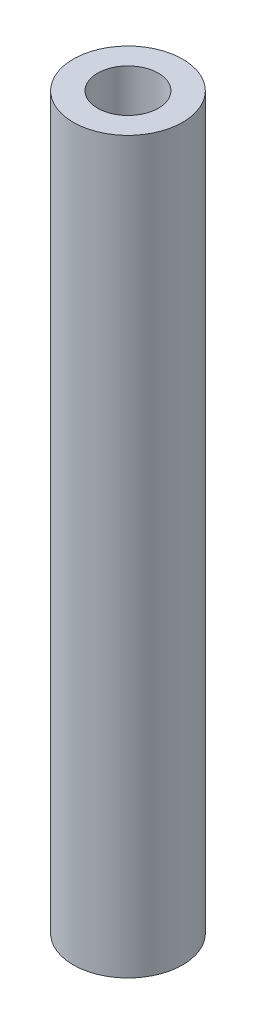
ISO-10303-21;
HEADER;
FILE_DESCRIPTION(('STEP AP214'),'2;1');
FILE_NAME('part.step','',(''),(''),'','','');
FILE_SCHEMA(('AUTOMOTIVE_DESIGN { 1 0 10303 214 1 1 1 1 }'));
ENDSEC;
DATA;
#1=APPLICATION_CONTEXT('core data for automotive mechanical design processes');
#2=APPLICATION_PROTOCOL_DEFINITION('international standard','automotive_design',2000,#1);
#3=PRODUCT_CONTEXT('',#1,'mechanical');
#4=PRODUCT('Part','Part','',(#3));
#5=PRODUCT_RELATED_PRODUCT_CATEGORY('part','',(#4));
#6=PRODUCT_DEFINITION_FORMATION('','',#4);
#7=PRODUCT_DEFINITION_CONTEXT('part definition',#1,'design');
#8=PRODUCT_DEFINITION('design','',#6,#7);
#9=PRODUCT_DEFINITION_SHAPE('','',#8);
#10=(LENGTH_UNIT() NAMED_UNIT(*) SI_UNIT(.MILLI.,.METRE.));
#11=(NAMED_UNIT(*) PLANE_ANGLE_UNIT() SI_UNIT($,.RADIAN.));
#12=(NAMED_UNIT(*) SI_UNIT($,.STERADIAN.) SOLID_ANGLE_UNIT());
#13=UNCERTAINTY_MEASURE_WITH_UNIT(LENGTH_MEASURE(1.E-05),#10,'distance_accuracy_value','');
#14=(GEOMETRIC_REPRESENTATION_CONTEXT(3) GLOBAL_UNCERTAINTY_ASSIGNED_CONTEXT((#13)) GLOBAL_UNIT_ASSIGNED_CONTEXT((#10,
#11,#12)) REPRESENTATION_CONTEXT('',''));
#15=CARTESIAN_POINT('',(0.,0.,0.));
#16=DIRECTION('',(0.,0.,1.));
#17=DIRECTION('',(1.,0.,0.));
#18=AXIS2_PLACEMENT_3D('',#15,#16,#17);
#19=CARTESIAN_POINT('',(0.,30.,0.));
#20=DIRECTION('',(0.,1.,0.));
#21=DIRECTION('',(0.,0.,1.));
#22=AXIS2_PLACEMENT_3D('',#19,#20,#21);
#23=PLANE('',#22);
#24=CARTESIAN_POINT('',(0.,30.,0.));
#25=DIRECTION('',(0.,1.,0.));
#26=DIRECTION('',(0.,0.,1.));
#27=AXIS2_PLACEMENT_3D('',#24,#25,#26);
#28=CIRCLE('',#27,2.25);
#29=CARTESIAN_POINT('',(0.,30.,2.25));
#30=VERTEX_POINT('',#29);
#31=EDGE_CURVE('E10',#30,#30,#28,.T.);
#32=ORIENTED_EDGE('',*,*,#31,.T.);
#33=EDGE_LOOP('',(#32));
#34=FACE_BOUND('',#33,.T.);
#35=CARTESIAN_POINT('',(0.,30.,0.));
#36=DIRECTION('',(0.,1.,0.));
#37=DIRECTION('',(0.,0.,1.));
#38=AXIS2_PLACEMENT_3D('',#35,#36,#37);
#39=CIRCLE('',#38,1.25);
#40=CARTESIAN_POINT('',(0.,30.,1.25));
#41=VERTEX_POINT('',#40);
#42=EDGE_CURVE('E54',#41,#41,#39,.T.);
#43=ORIENTED_EDGE('',*,*,#42,.F.);
#44=EDGE_LOOP('',(#43));
#45=FACE_BOUND('',#44,.T.);
#46=ADVANCED_FACE('F41',(#34,#45),#23,.T.);
#47=CARTESIAN_POINT('',(0.,0.,0.));
#48=DIRECTION('',(0.,1.,0.));
#49=DIRECTION('',(0.,0.,1.));
#50=AXIS2_PLACEMENT_3D('',#47,#48,#49);
#51=PLANE('',#50);
#52=CARTESIAN_POINT('',(0.,0.,0.));
#53=DIRECTION('',(0.,1.,0.));
#54=DIRECTION('',(0.,0.,1.));
#55=AXIS2_PLACEMENT_3D('',#52,#53,#54);
#56=CIRCLE('',#55,2.25);
#57=CARTESIAN_POINT('',(0.,0.,2.25));
#58=VERTEX_POINT('',#57);
#59=EDGE_CURVE('E45',#58,#58,#56,.T.);
#60=ORIENTED_EDGE('',*,*,#59,.F.);
#61=EDGE_LOOP('',(#60));
#62=FACE_BOUND('',#61,.T.);
#63=CARTESIAN_POINT('',(0.,0.,0.));
#64=DIRECTION('',(0.,1.,0.));
#65=DIRECTION('',(0.,0.,1.));
#66=AXIS2_PLACEMENT_3D('',#63,#64,#65);
#67=CIRCLE('',#66,1.25);
#68=CARTESIAN_POINT('',(0.,0.,1.25));
#69=VERTEX_POINT('',#68);
#70=EDGE_CURVE('E56',#69,#69,#67,.T.);
#71=ORIENTED_EDGE('',*,*,#70,.T.);
#72=EDGE_LOOP('',(#71));
#73=FACE_BOUND('',#72,.T.);
#74=ADVANCED_FACE('F68',(#62,#73),#51,.F.);
#75=CARTESIAN_POINT('',(0.,30.,0.));
#76=DIRECTION('',(0.,-1.,0.));
#77=DIRECTION('',(0.,0.,-1.));
#78=AXIS2_PLACEMENT_3D('',#75,#76,#77);
#79=CYLINDRICAL_SURFACE('',#78,2.25);
#80=ORIENTED_EDGE('',*,*,#31,.F.);
#81=EDGE_LOOP('',(#80));
#82=FACE_BOUND('',#81,.T.);
#83=ORIENTED_EDGE('',*,*,#59,.T.);
#84=EDGE_LOOP('',(#83));
#85=FACE_BOUND('',#84,.T.);
#86=ADVANCED_FACE('F43',(#82,#85),#79,.T.);
#87=CARTESIAN_POINT('',(0.,30.,0.));
#88=DIRECTION('',(0.,-1.,0.));
#89=DIRECTION('',(0.,0.,-1.));
#90=AXIS2_PLACEMENT_3D('',#87,#88,#89);
#91=CYLINDRICAL_SURFACE('',#90,1.25);
#92=ORIENTED_EDGE('',*,*,#42,.T.);
#93=EDGE_LOOP('',(#92));
#94=FACE_BOUND('',#93,.T.);
#95=ORIENTED_EDGE('',*,*,#70,.F.);
#96=EDGE_LOOP('',(#95));
#97=FACE_BOUND('',#96,.T.);
#98=ADVANCED_FACE('F64',(#94,#97),#91,.F.);
#99=CLOSED_SHELL('',(#46,#74,#86,#98));
#100=MANIFOLD_SOLID_BREP('B2',#99);
#101=ADVANCED_BREP_SHAPE_REPRESENTATION('',(#18,#100),#14);
#102=SHAPE_DEFINITION_REPRESENTATION(#9,#101);
ENDSEC;
END-ISO-10303-21;
